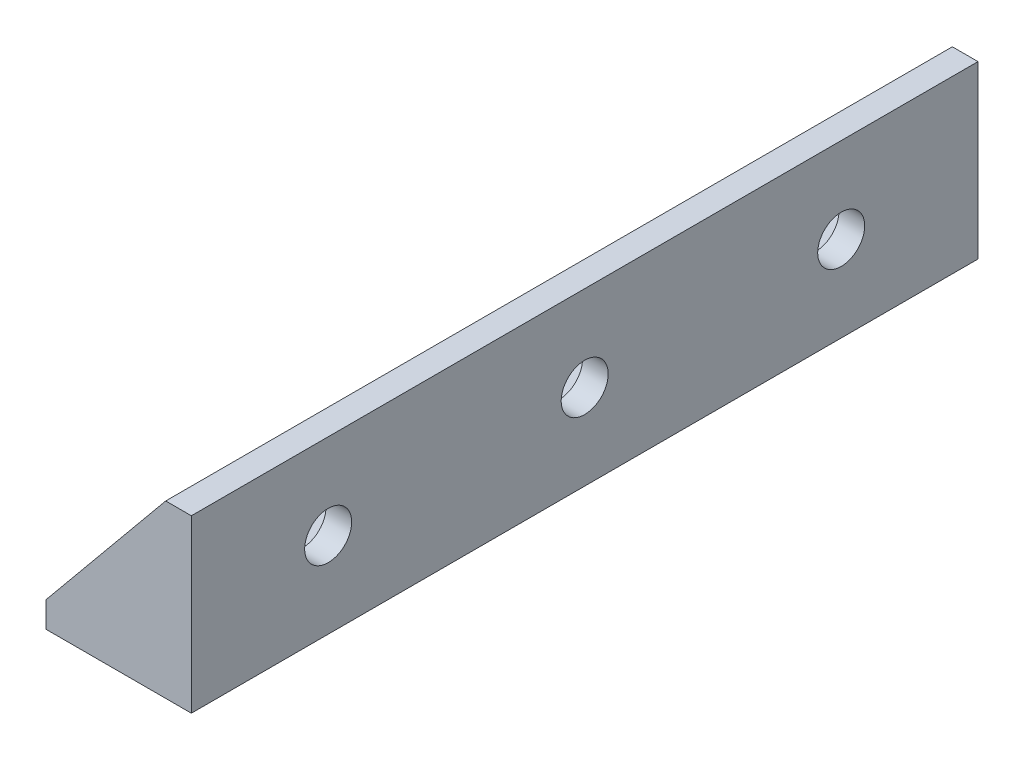
ISO-10303-21;
HEADER;
FILE_DESCRIPTION(('STEP AP214'),'2;1');
FILE_NAME('part.step','',(''),(''),'','','');
FILE_SCHEMA(('AUTOMOTIVE_DESIGN { 1 0 10303 214 1 1 1 1 }'));
ENDSEC;
DATA;
#1=APPLICATION_CONTEXT('core data for automotive mechanical design processes');
#2=APPLICATION_PROTOCOL_DEFINITION('international standard','automotive_design',2000,#1);
#3=PRODUCT_CONTEXT('',#1,'mechanical');
#4=PRODUCT('Part','Part','',(#3));
#5=PRODUCT_RELATED_PRODUCT_CATEGORY('part','',(#4));
#6=PRODUCT_DEFINITION_FORMATION('','',#4);
#7=PRODUCT_DEFINITION_CONTEXT('part definition',#1,'design');
#8=PRODUCT_DEFINITION('design','',#6,#7);
#9=PRODUCT_DEFINITION_SHAPE('','',#8);
#10=(LENGTH_UNIT() NAMED_UNIT(*) SI_UNIT(.MILLI.,.METRE.));
#11=(NAMED_UNIT(*) PLANE_ANGLE_UNIT() SI_UNIT($,.RADIAN.));
#12=(NAMED_UNIT(*) SI_UNIT($,.STERADIAN.) SOLID_ANGLE_UNIT());
#13=UNCERTAINTY_MEASURE_WITH_UNIT(LENGTH_MEASURE(1.E-05),#10,'distance_accuracy_value','');
#14=(GEOMETRIC_REPRESENTATION_CONTEXT(3) GLOBAL_UNCERTAINTY_ASSIGNED_CONTEXT((#13)) GLOBAL_UNIT_ASSIGNED_CONTEXT((#10,
#11,#12)) REPRESENTATION_CONTEXT('',''));
#15=CARTESIAN_POINT('',(0.,0.,0.));
#16=DIRECTION('',(0.,0.,1.));
#17=DIRECTION('',(1.,0.,0.));
#18=AXIS2_PLACEMENT_3D('',#15,#16,#17);
#19=CARTESIAN_POINT('',(0.,3.,0.));
#20=DIRECTION('',(0.,1.,0.));
#21=DIRECTION('',(0.,0.,1.));
#22=AXIS2_PLACEMENT_3D('',#19,#20,#21);
#23=PLANE('',#22);
#24=CARTESIAN_POINT('',(0.,3.,30.));
#25=DIRECTION('',(0.,1.,0.));
#26=DIRECTION('',(0.,0.,1.));
#27=AXIS2_PLACEMENT_3D('',#24,#25,#26);
#28=CIRCLE('',#27,2.5);
#29=CARTESIAN_POINT('',(0.,3.,32.5));
#30=VERTEX_POINT('',#29);
#31=EDGE_CURVE('E186',#30,#30,#28,.T.);
#32=ORIENTED_EDGE('',*,*,#31,.F.);
#33=EDGE_LOOP('',(#32));
#34=FACE_BOUND('',#33,.T.);
#35=DIRECTION('',(0.,0.,-1.));
#36=VECTOR('',#35,1.);
#37=CARTESIAN_POINT('',(6.99999999999999,3.,0.));
#38=LINE('',#37,#36);
#39=CARTESIAN_POINT('',(7.,3.,40.));
#40=VERTEX_POINT('',#39);
#41=CARTESIAN_POINT('',(7.,3.,19.));
#42=VERTEX_POINT('',#41);
#43=EDGE_CURVE('E64',#40,#42,#38,.T.);
#44=ORIENTED_EDGE('',*,*,#43,.T.);
#45=DIRECTION('',(-1.,0.,0.));
#46=VECTOR('',#45,1.);
#47=CARTESIAN_POINT('',(0.,3.,19.));
#48=LINE('',#47,#46);
#49=CARTESIAN_POINT('',(-7.,3.,19.));
#50=VERTEX_POINT('',#49);
#51=EDGE_CURVE('E212',#42,#50,#48,.T.);
#52=ORIENTED_EDGE('',*,*,#51,.T.);
#53=DIRECTION('',(0.,0.,1.));
#54=VECTOR('',#53,1.);
#55=CARTESIAN_POINT('',(-7.00000000000003,3.,0.));
#56=LINE('',#55,#54);
#57=CARTESIAN_POINT('',(-7.,3.,40.));
#58=VERTEX_POINT('',#57);
#59=EDGE_CURVE('E191',#50,#58,#56,.T.);
#60=ORIENTED_EDGE('',*,*,#59,.T.);
#61=DIRECTION('',(-1.,0.,0.));
#62=VECTOR('',#61,1.);
#63=CARTESIAN_POINT('',(0.,3.,40.));
#64=LINE('',#63,#62);
#65=EDGE_CURVE('E232',#40,#58,#64,.T.);
#66=ORIENTED_EDGE('',*,*,#65,.F.);
#67=EDGE_LOOP('',(#44,#52,#60,#66));
#68=FACE_BOUND('',#67,.T.);
#69=ADVANCED_FACE('F40',(#34,#68),#23,.T.);
#70=CARTESIAN_POINT('',(0.,3.,-30.));
#71=DIRECTION('',(0.,1.,0.));
#72=DIRECTION('',(0.,0.,1.));
#73=AXIS2_PLACEMENT_3D('',#70,#71,#72);
#74=CIRCLE('',#73,2.5);
#75=CARTESIAN_POINT('',(0.,3.,-27.5));
#76=VERTEX_POINT('',#75);
#77=EDGE_CURVE('E216',#76,#76,#74,.T.);
#78=ORIENTED_EDGE('',*,*,#77,.F.);
#79=EDGE_LOOP('',(#78));
#80=FACE_BOUND('',#79,.T.);
#81=DIRECTION('',(0.,0.,-1.));
#82=VECTOR('',#81,1.);
#83=CARTESIAN_POINT('',(6.99999999999998,3.,0.));
#84=LINE('',#83,#82);
#85=CARTESIAN_POINT('',(6.99999999999999,3.,-19.));
#86=VERTEX_POINT('',#85);
#87=CARTESIAN_POINT('',(7.,3.,-40.));
#88=VERTEX_POINT('',#87);
#89=EDGE_CURVE('E240',#86,#88,#84,.T.);
#90=ORIENTED_EDGE('',*,*,#89,.T.);
#91=DIRECTION('',(-1.,0.,0.));
#92=VECTOR('',#91,1.);
#93=CARTESIAN_POINT('',(0.,3.,-40.));
#94=LINE('',#93,#92);
#95=CARTESIAN_POINT('',(-7.,3.,-40.));
#96=VERTEX_POINT('',#95);
#97=EDGE_CURVE('E236',#88,#96,#94,.T.);
#98=ORIENTED_EDGE('',*,*,#97,.T.);
#99=CARTESIAN_POINT('',(-7.,3.,-19.));
#100=VERTEX_POINT('',#99);
#101=EDGE_CURVE('E165',#96,#100,#56,.T.);
#102=ORIENTED_EDGE('',*,*,#101,.T.);
#103=DIRECTION('',(-1.,0.,0.));
#104=VECTOR('',#103,1.);
#105=CARTESIAN_POINT('',(0.,3.,-19.));
#106=LINE('',#105,#104);
#107=EDGE_CURVE('E243',#86,#100,#106,.T.);
#108=ORIENTED_EDGE('',*,*,#107,.F.);
#109=EDGE_LOOP('',(#90,#98,#102,#108));
#110=FACE_BOUND('',#109,.T.);
#111=ADVANCED_FACE('F374',(#80,#110),#23,.T.);
#112=CARTESIAN_POINT('',(0.,3.,0.));
#113=DIRECTION('',(0.,1.,0.));
#114=DIRECTION('',(0.,0.,1.));
#115=AXIS2_PLACEMENT_3D('',#112,#113,#114);
#116=CIRCLE('',#115,2.5);
#117=CARTESIAN_POINT('',(0.,3.,2.5));
#118=VERTEX_POINT('',#117);
#119=EDGE_CURVE('E220',#118,#118,#116,.T.);
#120=ORIENTED_EDGE('',*,*,#119,.F.);
#121=EDGE_LOOP('',(#120));
#122=FACE_BOUND('',#121,.T.);
#123=DIRECTION('',(0.,0.,-1.));
#124=VECTOR('',#123,1.);
#125=CARTESIAN_POINT('',(7.,3.,0.));
#126=LINE('',#125,#124);
#127=CARTESIAN_POINT('',(7.,3.,11.));
#128=VERTEX_POINT('',#127);
#129=CARTESIAN_POINT('',(6.99999999999999,3.,-11.));
#130=VERTEX_POINT('',#129);
#131=EDGE_CURVE('E251',#128,#130,#126,.T.);
#132=ORIENTED_EDGE('',*,*,#131,.T.);
#133=DIRECTION('',(-1.,0.,0.));
#134=VECTOR('',#133,1.);
#135=CARTESIAN_POINT('',(0.,3.,-11.));
#136=LINE('',#135,#134);
#137=CARTESIAN_POINT('',(-7.,3.,-11.));
#138=VERTEX_POINT('',#137);
#139=EDGE_CURVE('E247',#130,#138,#136,.T.);
#140=ORIENTED_EDGE('',*,*,#139,.T.);
#141=CARTESIAN_POINT('',(-7.,3.,11.));
#142=VERTEX_POINT('',#141);
#143=EDGE_CURVE('E227',#138,#142,#56,.T.);
#144=ORIENTED_EDGE('',*,*,#143,.T.);
#145=DIRECTION('',(-1.,0.,0.));
#146=VECTOR('',#145,1.);
#147=CARTESIAN_POINT('',(0.,3.,11.));
#148=LINE('',#147,#146);
#149=EDGE_CURVE('E254',#128,#142,#148,.T.);
#150=ORIENTED_EDGE('',*,*,#149,.F.);
#151=EDGE_LOOP('',(#132,#140,#144,#150));
#152=FACE_BOUND('',#151,.T.);
#153=ADVANCED_FACE('F380',(#122,#152),#23,.T.);
#154=CARTESIAN_POINT('',(0.,3.,-46.));
#155=DIRECTION('',(0.,0.,-1.));
#156=DIRECTION('',(-1.,0.,0.));
#157=AXIS2_PLACEMENT_3D('',#154,#155,#156);
#158=PLANE('',#157);
#159=DIRECTION('',(0.6357072528611,0.77193023561705,0.));
#160=VECTOR('',#159,1.);
#161=CARTESIAN_POINT('',(-5.64329896907217,4.64742268041237,-46.));
#162=LINE('',#161,#160);
#163=CARTESIAN_POINT('',(-7.,3.,-46.));
#164=VERTEX_POINT('',#163);
#165=CARTESIAN_POINT('',(7.,20.,-46.));
#166=VERTEX_POINT('',#165);
#167=EDGE_CURVE('E142',#164,#166,#162,.T.);
#168=ORIENTED_EDGE('',*,*,#167,.T.);
#169=DIRECTION('',(1.,0.,0.));
#170=VECTOR('',#169,1.);
#171=CARTESIAN_POINT('',(0.,20.,-46.));
#172=LINE('',#171,#170);
#173=CARTESIAN_POINT('',(10.,20.,-46.));
#174=VERTEX_POINT('',#173);
#175=EDGE_CURVE('E290',#166,#174,#172,.T.);
#176=ORIENTED_EDGE('',*,*,#175,.T.);
#177=DIRECTION('',(0.,-1.,0.));
#178=VECTOR('',#177,1.);
#179=CARTESIAN_POINT('',(10.,3.,-46.));
#180=LINE('',#179,#178);
#181=CARTESIAN_POINT('',(10.,0.,-46.));
#182=VERTEX_POINT('',#181);
#183=EDGE_CURVE('E183',#174,#182,#180,.T.);
#184=ORIENTED_EDGE('',*,*,#183,.T.);
#185=DIRECTION('',(1.,0.,0.));
#186=VECTOR('',#185,1.);
#187=CARTESIAN_POINT('',(0.,0.,-46.));
#188=LINE('',#187,#186);
#189=CARTESIAN_POINT('',(-7.,0.,-46.));
#190=VERTEX_POINT('',#189);
#191=EDGE_CURVE('E171',#190,#182,#188,.T.);
#192=ORIENTED_EDGE('',*,*,#191,.F.);
#193=DIRECTION('',(0.,-1.,0.));
#194=VECTOR('',#193,1.);
#195=CARTESIAN_POINT('',(-7.,3.,-46.));
#196=LINE('',#195,#194);
#197=EDGE_CURVE('E161',#164,#190,#196,.T.);
#198=ORIENTED_EDGE('',*,*,#197,.F.);
#199=EDGE_LOOP('',(#168,#176,#184,#192,#198));
#200=FACE_BOUND('',#199,.T.);
#201=ADVANCED_FACE('F42',(#200),#158,.T.);
#202=CARTESIAN_POINT('',(-7.00000000000003,3.,0.));
#203=DIRECTION('',(1.,0.,0.));
#204=DIRECTION('',(0.,0.,-1.));
#205=AXIS2_PLACEMENT_3D('',#202,#203,#204);
#206=PLANE('',#205);
#207=DIRECTION('',(0.,-1.,0.));
#208=VECTOR('',#207,1.);
#209=CARTESIAN_POINT('',(-7.,3.,46.));
#210=LINE('',#209,#208);
#211=CARTESIAN_POINT('',(-7.,3.,46.));
#212=VERTEX_POINT('',#211);
#213=CARTESIAN_POINT('',(-7.,0.,46.));
#214=VERTEX_POINT('',#213);
#215=EDGE_CURVE('E173',#212,#214,#210,.T.);
#216=ORIENTED_EDGE('',*,*,#215,.F.);
#217=DIRECTION('',(0.,0.,1.));
#218=VECTOR('',#217,1.);
#219=CARTESIAN_POINT('',(-7.,3.,-46.));
#220=LINE('',#219,#218);
#221=EDGE_CURVE('E153',#58,#212,#220,.T.);
#222=ORIENTED_EDGE('',*,*,#221,.F.);
#223=ORIENTED_EDGE('',*,*,#59,.F.);
#224=EDGE_CURVE('E395',#142,#50,#220,.T.);
#225=ORIENTED_EDGE('',*,*,#224,.F.);
#226=ORIENTED_EDGE('',*,*,#143,.F.);
#227=EDGE_CURVE('E167',#100,#138,#220,.T.);
#228=ORIENTED_EDGE('',*,*,#227,.F.);
#229=ORIENTED_EDGE('',*,*,#101,.F.);
#230=EDGE_CURVE('E145',#164,#96,#220,.T.);
#231=ORIENTED_EDGE('',*,*,#230,.F.);
#232=ORIENTED_EDGE('',*,*,#197,.T.);
#233=DIRECTION('',(0.,0.,1.));
#234=VECTOR('',#233,1.);
#235=CARTESIAN_POINT('',(-7.00000000000003,0.,0.));
#236=LINE('',#235,#234);
#237=EDGE_CURVE('E207',#190,#214,#236,.T.);
#238=ORIENTED_EDGE('',*,*,#237,.T.);
#239=EDGE_LOOP('',(#216,#222,#223,#225,#226,#228,#229,#231,#232,#238));
#240=FACE_BOUND('',#239,.T.);
#241=ADVANCED_FACE('F159',(#240),#206,.F.);
#242=CARTESIAN_POINT('',(0.,3.,46.));
#243=DIRECTION('',(0.,0.,-1.));
#244=DIRECTION('',(-1.,0.,0.));
#245=AXIS2_PLACEMENT_3D('',#242,#243,#244);
#246=PLANE('',#245);
#247=DIRECTION('',(1.,0.,0.));
#248=VECTOR('',#247,1.);
#249=CARTESIAN_POINT('',(0.,20.,46.));
#250=LINE('',#249,#248);
#251=CARTESIAN_POINT('',(7.,20.,46.));
#252=VERTEX_POINT('',#251);
#253=CARTESIAN_POINT('',(10.,20.,46.));
#254=VERTEX_POINT('',#253);
#255=EDGE_CURVE('E297',#252,#254,#250,.T.);
#256=ORIENTED_EDGE('',*,*,#255,.F.);
#257=DIRECTION('',(-0.6357072528611,-0.77193023561705,0.));
#258=VECTOR('',#257,1.);
#259=CARTESIAN_POINT('',(-4.17113402061856,6.43505154639175,46.));
#260=LINE('',#259,#258);
#261=EDGE_CURVE('E56',#252,#212,#260,.T.);
#262=ORIENTED_EDGE('',*,*,#261,.T.);
#263=ORIENTED_EDGE('',*,*,#215,.T.);
#264=DIRECTION('',(1.,0.,0.));
#265=VECTOR('',#264,1.);
#266=CARTESIAN_POINT('',(0.,0.,46.));
#267=LINE('',#266,#265);
#268=CARTESIAN_POINT('',(10.,0.,46.));
#269=VERTEX_POINT('',#268);
#270=EDGE_CURVE('E204',#214,#269,#267,.T.);
#271=ORIENTED_EDGE('',*,*,#270,.T.);
#272=DIRECTION('',(0.,-1.,0.));
#273=VECTOR('',#272,1.);
#274=CARTESIAN_POINT('',(10.,3.,46.));
#275=LINE('',#274,#273);
#276=EDGE_CURVE('E178',#254,#269,#275,.T.);
#277=ORIENTED_EDGE('',*,*,#276,.F.);
#278=EDGE_LOOP('',(#256,#262,#263,#271,#277));
#279=FACE_BOUND('',#278,.T.);
#280=ADVANCED_FACE('F405',(#279),#246,.F.);
#281=CARTESIAN_POINT('',(0.,3.,-30.));
#282=DIRECTION('',(0.,-1.,0.));
#283=DIRECTION('',(0.,0.,-1.));
#284=AXIS2_PLACEMENT_3D('',#281,#282,#283);
#285=CYLINDRICAL_SURFACE('',#284,2.5);
#286=ORIENTED_EDGE('',*,*,#77,.T.);
#287=EDGE_LOOP('',(#286));
#288=FACE_BOUND('',#287,.T.);
#289=CARTESIAN_POINT('',(0.,0.,-30.));
#290=DIRECTION('',(0.,1.,0.));
#291=DIRECTION('',(0.,0.,1.));
#292=AXIS2_PLACEMENT_3D('',#289,#290,#291);
#293=CIRCLE('',#292,2.5);
#294=CARTESIAN_POINT('',(0.,0.,-27.5));
#295=VERTEX_POINT('',#294);
#296=EDGE_CURVE('E192',#295,#295,#293,.T.);
#297=ORIENTED_EDGE('',*,*,#296,.F.);
#298=EDGE_LOOP('',(#297));
#299=FACE_BOUND('',#298,.T.);
#300=ADVANCED_FACE('F457',(#288,#299),#285,.F.);
#301=CARTESIAN_POINT('',(0.,3.,0.));
#302=DIRECTION('',(0.,-1.,0.));
#303=DIRECTION('',(0.,0.,-1.));
#304=AXIS2_PLACEMENT_3D('',#301,#302,#303);
#305=CYLINDRICAL_SURFACE('',#304,2.5);
#306=ORIENTED_EDGE('',*,*,#119,.T.);
#307=EDGE_LOOP('',(#306));
#308=FACE_BOUND('',#307,.T.);
#309=CARTESIAN_POINT('',(0.,0.,0.));
#310=DIRECTION('',(0.,1.,0.));
#311=DIRECTION('',(0.,0.,1.));
#312=AXIS2_PLACEMENT_3D('',#309,#310,#311);
#313=CIRCLE('',#312,2.5);
#314=CARTESIAN_POINT('',(0.,0.,2.5));
#315=VERTEX_POINT('',#314);
#316=EDGE_CURVE('E196',#315,#315,#313,.T.);
#317=ORIENTED_EDGE('',*,*,#316,.F.);
#318=EDGE_LOOP('',(#317));
#319=FACE_BOUND('',#318,.T.);
#320=ADVANCED_FACE('F454',(#308,#319),#305,.F.);
#321=CARTESIAN_POINT('',(10.,3.,0.));
#322=DIRECTION('',(1.,0.,0.));
#323=DIRECTION('',(0.,0.,-1.));
#324=AXIS2_PLACEMENT_3D('',#321,#322,#323);
#325=PLANE('',#324);
#326=CARTESIAN_POINT('',(10.,10.,-30.));
#327=DIRECTION('',(1.,0.,0.));
#328=DIRECTION('',(0.,0.,-1.));
#329=AXIS2_PLACEMENT_3D('',#326,#327,#328);
#330=CIRCLE('',#329,2.75);
#331=CARTESIAN_POINT('',(10.,10.,-32.75));
#332=VERTEX_POINT('',#331);
#333=EDGE_CURVE('E331',#332,#332,#330,.T.);
#334=ORIENTED_EDGE('',*,*,#333,.F.);
#335=EDGE_LOOP('',(#334));
#336=FACE_BOUND('',#335,.T.);
#337=CARTESIAN_POINT('',(10.,10.,0.));
#338=DIRECTION('',(1.,0.,0.));
#339=DIRECTION('',(0.,0.,-1.));
#340=AXIS2_PLACEMENT_3D('',#337,#338,#339);
#341=CIRCLE('',#340,2.75);
#342=CARTESIAN_POINT('',(10.,10.,-2.75));
#343=VERTEX_POINT('',#342);
#344=EDGE_CURVE('E334',#343,#343,#341,.T.);
#345=ORIENTED_EDGE('',*,*,#344,.F.);
#346=EDGE_LOOP('',(#345));
#347=FACE_BOUND('',#346,.T.);
#348=CARTESIAN_POINT('',(10.,10.,30.));
#349=DIRECTION('',(1.,0.,0.));
#350=DIRECTION('',(0.,0.,-1.));
#351=AXIS2_PLACEMENT_3D('',#348,#349,#350);
#352=CIRCLE('',#351,2.75);
#353=CARTESIAN_POINT('',(10.,10.,27.25));
#354=VERTEX_POINT('',#353);
#355=EDGE_CURVE('E154',#354,#354,#352,.T.);
#356=ORIENTED_EDGE('',*,*,#355,.F.);
#357=EDGE_LOOP('',(#356));
#358=FACE_BOUND('',#357,.T.);
#359=DIRECTION('',(0.,0.,1.));
#360=VECTOR('',#359,1.);
#361=CARTESIAN_POINT('',(10.,0.,0.));
#362=LINE('',#361,#360);
#363=EDGE_CURVE('E200',#182,#269,#362,.T.);
#364=ORIENTED_EDGE('',*,*,#363,.F.);
#365=ORIENTED_EDGE('',*,*,#183,.F.);
#366=DIRECTION('',(0.,0.,1.));
#367=VECTOR('',#366,1.);
#368=CARTESIAN_POINT('',(10.,20.,0.));
#369=LINE('',#368,#367);
#370=EDGE_CURVE('E293',#174,#254,#369,.T.);
#371=ORIENTED_EDGE('',*,*,#370,.T.);
#372=ORIENTED_EDGE('',*,*,#276,.T.);
#373=EDGE_LOOP('',(#364,#365,#371,#372));
#374=FACE_BOUND('',#373,.T.);
#375=ADVANCED_FACE('F414',(#336,#347,#358,#374),#325,.T.);
#376=CARTESIAN_POINT('',(0.,3.,30.));
#377=DIRECTION('',(0.,-1.,0.));
#378=DIRECTION('',(0.,0.,-1.));
#379=AXIS2_PLACEMENT_3D('',#376,#377,#378);
#380=CYLINDRICAL_SURFACE('',#379,2.5);
#381=ORIENTED_EDGE('',*,*,#31,.T.);
#382=EDGE_LOOP('',(#381));
#383=FACE_BOUND('',#382,.T.);
#384=CARTESIAN_POINT('',(0.,0.,30.));
#385=DIRECTION('',(0.,1.,0.));
#386=DIRECTION('',(0.,0.,1.));
#387=AXIS2_PLACEMENT_3D('',#384,#385,#386);
#388=CIRCLE('',#387,2.5);
#389=CARTESIAN_POINT('',(0.,0.,32.5));
#390=VERTEX_POINT('',#389);
#391=EDGE_CURVE('E187',#390,#390,#388,.T.);
#392=ORIENTED_EDGE('',*,*,#391,.F.);
#393=EDGE_LOOP('',(#392));
#394=FACE_BOUND('',#393,.T.);
#395=ADVANCED_FACE('F462',(#383,#394),#380,.F.);
#396=CARTESIAN_POINT('',(0.,0.,0.));
#397=DIRECTION('',(0.,1.,0.));
#398=DIRECTION('',(0.,0.,1.));
#399=AXIS2_PLACEMENT_3D('',#396,#397,#398);
#400=PLANE('',#399);
#401=ORIENTED_EDGE('',*,*,#270,.F.);
#402=ORIENTED_EDGE('',*,*,#237,.F.);
#403=ORIENTED_EDGE('',*,*,#191,.T.);
#404=ORIENTED_EDGE('',*,*,#363,.T.);
#405=EDGE_LOOP('',(#401,#402,#403,#404));
#406=FACE_BOUND('',#405,.T.);
#407=ORIENTED_EDGE('',*,*,#316,.T.);
#408=EDGE_LOOP('',(#407));
#409=FACE_BOUND('',#408,.T.);
#410=ORIENTED_EDGE('',*,*,#296,.T.);
#411=EDGE_LOOP('',(#410));
#412=FACE_BOUND('',#411,.T.);
#413=ORIENTED_EDGE('',*,*,#391,.T.);
#414=EDGE_LOOP('',(#413));
#415=FACE_BOUND('',#414,.T.);
#416=ADVANCED_FACE('F409',(#406,#409,#412,#415),#400,.F.);
#417=CARTESIAN_POINT('',(0.,20.,19.));
#418=DIRECTION('',(0.,0.,-1.));
#419=DIRECTION('',(-1.,0.,0.));
#420=AXIS2_PLACEMENT_3D('',#417,#418,#419);
#421=PLANE('',#420);
#422=DIRECTION('',(0.,-1.,0.));
#423=VECTOR('',#422,1.);
#424=CARTESIAN_POINT('',(7.,20.,19.));
#425=LINE('',#424,#423);
#426=CARTESIAN_POINT('',(7.,20.,19.));
#427=VERTEX_POINT('',#426);
#428=EDGE_CURVE('E258',#427,#42,#425,.T.);
#429=ORIENTED_EDGE('',*,*,#428,.F.);
#430=DIRECTION('',(-0.6357072528611,-0.77193023561705,0.));
#431=VECTOR('',#430,1.);
#432=CARTESIAN_POINT('',(4.17113402061856,16.5649484536082,19.));
#433=LINE('',#432,#431);
#434=EDGE_CURVE('E306',#427,#50,#433,.T.);
#435=ORIENTED_EDGE('',*,*,#434,.T.);
#436=ORIENTED_EDGE('',*,*,#51,.F.);
#437=EDGE_LOOP('',(#429,#435,#436));
#438=FACE_BOUND('',#437,.T.);
#439=ADVANCED_FACE('F424',(#438),#421,.F.);
#440=CARTESIAN_POINT('',(6.99999999999999,20.,0.));
#441=DIRECTION('',(1.,0.,0.));
#442=DIRECTION('',(0.,0.,-1.));
#443=AXIS2_PLACEMENT_3D('',#440,#441,#442);
#444=PLANE('',#443);
#445=CARTESIAN_POINT('',(6.99999999999998,10.,30.));
#446=DIRECTION('',(-1.,0.,0.));
#447=DIRECTION('',(0.,0.,1.));
#448=AXIS2_PLACEMENT_3D('',#445,#446,#447);
#449=CIRCLE('',#448,2.75);
#450=CARTESIAN_POINT('',(6.99999999999998,10.,32.75));
#451=VERTEX_POINT('',#450);
#452=EDGE_CURVE('E339',#451,#451,#449,.T.);
#453=ORIENTED_EDGE('',*,*,#452,.F.);
#454=EDGE_LOOP('',(#453));
#455=FACE_BOUND('',#454,.T.);
#456=ORIENTED_EDGE('',*,*,#43,.F.);
#457=DIRECTION('',(0.,-1.,0.));
#458=VECTOR('',#457,1.);
#459=CARTESIAN_POINT('',(7.,20.,40.));
#460=LINE('',#459,#458);
#461=CARTESIAN_POINT('',(7.,20.,40.));
#462=VERTEX_POINT('',#461);
#463=EDGE_CURVE('E262',#462,#40,#460,.T.);
#464=ORIENTED_EDGE('',*,*,#463,.F.);
#465=DIRECTION('',(0.,0.,1.));
#466=VECTOR('',#465,1.);
#467=CARTESIAN_POINT('',(6.99999999999999,20.,0.));
#468=LINE('',#467,#466);
#469=EDGE_CURVE('E300',#427,#462,#468,.T.);
#470=ORIENTED_EDGE('',*,*,#469,.F.);
#471=ORIENTED_EDGE('',*,*,#428,.T.);
#472=EDGE_LOOP('',(#456,#464,#470,#471));
#473=FACE_BOUND('',#472,.T.);
#474=ADVANCED_FACE('F421',(#455,#473),#444,.F.);
#475=CARTESIAN_POINT('',(0.,20.,40.));
#476=DIRECTION('',(0.,0.,-1.));
#477=DIRECTION('',(-1.,0.,0.));
#478=AXIS2_PLACEMENT_3D('',#475,#476,#477);
#479=PLANE('',#478);
#480=DIRECTION('',(-0.6357072528611,-0.77193023561705,0.));
#481=VECTOR('',#480,1.);
#482=CARTESIAN_POINT('',(4.17113402061856,16.5649484536082,40.));
#483=LINE('',#482,#481);
#484=EDGE_CURVE('E310',#462,#58,#483,.T.);
#485=ORIENTED_EDGE('',*,*,#484,.F.);
#486=ORIENTED_EDGE('',*,*,#463,.T.);
#487=ORIENTED_EDGE('',*,*,#65,.T.);
#488=EDGE_LOOP('',(#485,#486,#487));
#489=FACE_BOUND('',#488,.T.);
#490=ADVANCED_FACE('F419',(#489),#479,.T.);
#491=CARTESIAN_POINT('',(0.,20.,-40.));
#492=DIRECTION('',(0.,0.,-1.));
#493=DIRECTION('',(-1.,0.,0.));
#494=AXIS2_PLACEMENT_3D('',#491,#492,#493);
#495=PLANE('',#494);
#496=DIRECTION('',(0.,-1.,0.));
#497=VECTOR('',#496,1.);
#498=CARTESIAN_POINT('',(7.,20.,-40.));
#499=LINE('',#498,#497);
#500=CARTESIAN_POINT('',(7.,20.,-40.));
#501=VERTEX_POINT('',#500);
#502=EDGE_CURVE('E266',#501,#88,#499,.T.);
#503=ORIENTED_EDGE('',*,*,#502,.F.);
#504=DIRECTION('',(-0.6357072528611,-0.77193023561705,0.));
#505=VECTOR('',#504,1.);
#506=CARTESIAN_POINT('',(4.17113402061856,16.5649484536082,-40.));
#507=LINE('',#506,#505);
#508=EDGE_CURVE('E313',#501,#96,#507,.T.);
#509=ORIENTED_EDGE('',*,*,#508,.T.);
#510=ORIENTED_EDGE('',*,*,#97,.F.);
#511=EDGE_LOOP('',(#503,#509,#510));
#512=FACE_BOUND('',#511,.T.);
#513=ADVANCED_FACE('F357',(#512),#495,.F.);
#514=CARTESIAN_POINT('',(6.99999999999998,20.,0.));
#515=DIRECTION('',(1.,0.,0.));
#516=DIRECTION('',(0.,0.,-1.));
#517=AXIS2_PLACEMENT_3D('',#514,#515,#516);
#518=PLANE('',#517);
#519=CARTESIAN_POINT('',(6.99999999999998,10.,-30.));
#520=DIRECTION('',(-1.,0.,0.));
#521=DIRECTION('',(0.,0.,1.));
#522=AXIS2_PLACEMENT_3D('',#519,#520,#521);
#523=CIRCLE('',#522,2.75);
#524=CARTESIAN_POINT('',(6.99999999999998,10.,-27.25));
#525=VERTEX_POINT('',#524);
#526=EDGE_CURVE('E338',#525,#525,#523,.T.);
#527=ORIENTED_EDGE('',*,*,#526,.F.);
#528=EDGE_LOOP('',(#527));
#529=FACE_BOUND('',#528,.T.);
#530=ORIENTED_EDGE('',*,*,#89,.F.);
#531=DIRECTION('',(0.,-1.,0.));
#532=VECTOR('',#531,1.);
#533=CARTESIAN_POINT('',(6.99999999999999,20.,-19.));
#534=LINE('',#533,#532);
#535=CARTESIAN_POINT('',(7.,20.,-19.));
#536=VERTEX_POINT('',#535);
#537=EDGE_CURVE('E270',#536,#86,#534,.T.);
#538=ORIENTED_EDGE('',*,*,#537,.F.);
#539=DIRECTION('',(0.,0.,1.));
#540=VECTOR('',#539,1.);
#541=CARTESIAN_POINT('',(6.99999999999998,20.,0.));
#542=LINE('',#541,#540);
#543=EDGE_CURVE('E286',#501,#536,#542,.T.);
#544=ORIENTED_EDGE('',*,*,#543,.F.);
#545=ORIENTED_EDGE('',*,*,#502,.T.);
#546=EDGE_LOOP('',(#530,#538,#544,#545));
#547=FACE_BOUND('',#546,.T.);
#548=ADVANCED_FACE('F353',(#529,#547),#518,.F.);
#549=CARTESIAN_POINT('',(0.,20.,-19.));
#550=DIRECTION('',(0.,0.,-1.));
#551=DIRECTION('',(-1.,0.,0.));
#552=AXIS2_PLACEMENT_3D('',#549,#550,#551);
#553=PLANE('',#552);
#554=DIRECTION('',(-0.6357072528611,-0.77193023561705,0.));
#555=VECTOR('',#554,1.);
#556=CARTESIAN_POINT('',(4.17113402061856,16.5649484536082,-19.));
#557=LINE('',#556,#555);
#558=EDGE_CURVE('E316',#536,#100,#557,.T.);
#559=ORIENTED_EDGE('',*,*,#558,.F.);
#560=ORIENTED_EDGE('',*,*,#537,.T.);
#561=ORIENTED_EDGE('',*,*,#107,.T.);
#562=EDGE_LOOP('',(#559,#560,#561));
#563=FACE_BOUND('',#562,.T.);
#564=ADVANCED_FACE('F356',(#563),#553,.T.);
#565=CARTESIAN_POINT('',(0.,20.,-11.));
#566=DIRECTION('',(0.,0.,-1.));
#567=DIRECTION('',(-1.,0.,0.));
#568=AXIS2_PLACEMENT_3D('',#565,#566,#567);
#569=PLANE('',#568);
#570=DIRECTION('',(0.,-1.,0.));
#571=VECTOR('',#570,1.);
#572=CARTESIAN_POINT('',(6.99999999999999,20.,-11.));
#573=LINE('',#572,#571);
#574=CARTESIAN_POINT('',(6.99999999999999,20.,-11.));
#575=VERTEX_POINT('',#574);
#576=EDGE_CURVE('E274',#575,#130,#573,.T.);
#577=ORIENTED_EDGE('',*,*,#576,.F.);
#578=DIRECTION('',(-0.6357072528611,-0.77193023561705,0.));
#579=VECTOR('',#578,1.);
#580=CARTESIAN_POINT('',(4.17113402061856,16.5649484536082,-11.));
#581=LINE('',#580,#579);
#582=EDGE_CURVE('E319',#575,#138,#581,.T.);
#583=ORIENTED_EDGE('',*,*,#582,.T.);
#584=ORIENTED_EDGE('',*,*,#139,.F.);
#585=EDGE_LOOP('',(#577,#583,#584));
#586=FACE_BOUND('',#585,.T.);
#587=ADVANCED_FACE('F392',(#586),#569,.F.);
#588=CARTESIAN_POINT('',(7.,20.,0.));
#589=DIRECTION('',(1.,0.,0.));
#590=DIRECTION('',(0.,0.,-1.));
#591=AXIS2_PLACEMENT_3D('',#588,#589,#590);
#592=PLANE('',#591);
#593=CARTESIAN_POINT('',(6.99999999999998,10.,0.));
#594=DIRECTION('',(-1.,0.,0.));
#595=DIRECTION('',(0.,0.,1.));
#596=AXIS2_PLACEMENT_3D('',#593,#594,#595);
#597=CIRCLE('',#596,2.75);
#598=CARTESIAN_POINT('',(6.99999999999998,10.,2.75));
#599=VERTEX_POINT('',#598);
#600=EDGE_CURVE('E343',#599,#599,#597,.T.);
#601=ORIENTED_EDGE('',*,*,#600,.F.);
#602=EDGE_LOOP('',(#601));
#603=FACE_BOUND('',#602,.T.);
#604=ORIENTED_EDGE('',*,*,#131,.F.);
#605=DIRECTION('',(0.,-1.,0.));
#606=VECTOR('',#605,1.);
#607=CARTESIAN_POINT('',(7.,20.,11.));
#608=LINE('',#607,#606);
#609=CARTESIAN_POINT('',(7.,20.,11.));
#610=VERTEX_POINT('',#609);
#611=EDGE_CURVE('E278',#610,#128,#608,.T.);
#612=ORIENTED_EDGE('',*,*,#611,.F.);
#613=DIRECTION('',(0.,0.,1.));
#614=VECTOR('',#613,1.);
#615=CARTESIAN_POINT('',(7.,20.,0.));
#616=LINE('',#615,#614);
#617=EDGE_CURVE('E282',#575,#610,#616,.T.);
#618=ORIENTED_EDGE('',*,*,#617,.F.);
#619=ORIENTED_EDGE('',*,*,#576,.T.);
#620=EDGE_LOOP('',(#604,#612,#618,#619));
#621=FACE_BOUND('',#620,.T.);
#622=ADVANCED_FACE('F390',(#603,#621),#592,.F.);
#623=CARTESIAN_POINT('',(0.,20.,11.));
#624=DIRECTION('',(0.,0.,-1.));
#625=DIRECTION('',(-1.,0.,0.));
#626=AXIS2_PLACEMENT_3D('',#623,#624,#625);
#627=PLANE('',#626);
#628=DIRECTION('',(-0.6357072528611,-0.77193023561705,0.));
#629=VECTOR('',#628,1.);
#630=CARTESIAN_POINT('',(4.17113402061856,16.5649484536082,11.));
#631=LINE('',#630,#629);
#632=EDGE_CURVE('E323',#610,#142,#631,.T.);
#633=ORIENTED_EDGE('',*,*,#632,.F.);
#634=ORIENTED_EDGE('',*,*,#611,.T.);
#635=ORIENTED_EDGE('',*,*,#149,.T.);
#636=EDGE_LOOP('',(#633,#634,#635));
#637=FACE_BOUND('',#636,.T.);
#638=ADVANCED_FACE('F386',(#637),#627,.T.);
#639=CARTESIAN_POINT('',(0.,20.,0.));
#640=DIRECTION('',(0.,1.,0.));
#641=DIRECTION('',(0.,0.,1.));
#642=AXIS2_PLACEMENT_3D('',#639,#640,#641);
#643=PLANE('',#642);
#644=DIRECTION('',(0.,0.,-1.));
#645=VECTOR('',#644,1.);
#646=CARTESIAN_POINT('',(7.,20.,0.));
#647=LINE('',#646,#645);
#648=EDGE_CURVE('E11',#252,#462,#647,.T.);
#649=ORIENTED_EDGE('',*,*,#648,.F.);
#650=ORIENTED_EDGE('',*,*,#255,.T.);
#651=ORIENTED_EDGE('',*,*,#370,.F.);
#652=ORIENTED_EDGE('',*,*,#175,.F.);
#653=DIRECTION('',(0.,0.,1.));
#654=VECTOR('',#653,1.);
#655=CARTESIAN_POINT('',(7.,20.,-46.));
#656=LINE('',#655,#654);
#657=EDGE_CURVE('E148',#166,#501,#656,.T.);
#658=ORIENTED_EDGE('',*,*,#657,.T.);
#659=ORIENTED_EDGE('',*,*,#543,.T.);
#660=EDGE_CURVE('E50',#575,#536,#647,.T.);
#661=ORIENTED_EDGE('',*,*,#660,.F.);
#662=ORIENTED_EDGE('',*,*,#617,.T.);
#663=EDGE_CURVE('E49',#427,#610,#647,.T.);
#664=ORIENTED_EDGE('',*,*,#663,.F.);
#665=ORIENTED_EDGE('',*,*,#469,.T.);
#666=EDGE_LOOP('',(#649,#650,#651,#652,#658,#659,#661,#662,#664,#665));
#667=FACE_BOUND('',#666,.T.);
#668=ADVANCED_FACE('F370',(#667),#643,.T.);
#669=CARTESIAN_POINT('',(-5.64329896907217,4.64742268041237,-46.));
#670=DIRECTION('',(0.77193023561705,-0.6357072528611,0.));
#671=DIRECTION('',(0.6357072528611,0.77193023561705,0.));
#672=AXIS2_PLACEMENT_3D('',#669,#670,#671);
#673=PLANE('',#672);
#674=ORIENTED_EDGE('',*,*,#657,.F.);
#675=ORIENTED_EDGE('',*,*,#167,.F.);
#676=ORIENTED_EDGE('',*,*,#230,.T.);
#677=ORIENTED_EDGE('',*,*,#508,.F.);
#678=EDGE_LOOP('',(#674,#675,#676,#677));
#679=FACE_BOUND('',#678,.T.);
#680=ADVANCED_FACE('F144',(#679),#673,.F.);
#681=ORIENTED_EDGE('',*,*,#558,.T.);
#682=ORIENTED_EDGE('',*,*,#227,.T.);
#683=ORIENTED_EDGE('',*,*,#582,.F.);
#684=ORIENTED_EDGE('',*,*,#660,.T.);
#685=EDGE_LOOP('',(#681,#682,#683,#684));
#686=FACE_BOUND('',#685,.T.);
#687=ADVANCED_FACE('F393',(#686),#673,.F.);
#688=ORIENTED_EDGE('',*,*,#663,.T.);
#689=ORIENTED_EDGE('',*,*,#632,.T.);
#690=ORIENTED_EDGE('',*,*,#224,.T.);
#691=ORIENTED_EDGE('',*,*,#434,.F.);
#692=EDGE_LOOP('',(#688,#689,#690,#691));
#693=FACE_BOUND('',#692,.T.);
#694=ADVANCED_FACE('F425',(#693),#673,.F.);
#695=ORIENTED_EDGE('',*,*,#648,.T.);
#696=ORIENTED_EDGE('',*,*,#484,.T.);
#697=ORIENTED_EDGE('',*,*,#221,.T.);
#698=ORIENTED_EDGE('',*,*,#261,.F.);
#699=EDGE_LOOP('',(#695,#696,#697,#698));
#700=FACE_BOUND('',#699,.T.);
#701=ADVANCED_FACE('F400',(#700),#673,.F.);
#702=CARTESIAN_POINT('',(12.,10.,0.));
#703=DIRECTION('',(-1.,0.,0.));
#704=DIRECTION('',(0.,0.,1.));
#705=AXIS2_PLACEMENT_3D('',#702,#703,#704);
#706=CYLINDRICAL_SURFACE('',#705,2.75);
#707=ORIENTED_EDGE('',*,*,#344,.T.);
#708=EDGE_LOOP('',(#707));
#709=FACE_BOUND('',#708,.T.);
#710=ORIENTED_EDGE('',*,*,#600,.T.);
#711=EDGE_LOOP('',(#710));
#712=FACE_BOUND('',#711,.T.);
#713=ADVANCED_FACE('F433',(#709,#712),#706,.F.);
#714=CARTESIAN_POINT('',(12.,10.,-30.));
#715=DIRECTION('',(-1.,0.,0.));
#716=DIRECTION('',(0.,0.,1.));
#717=AXIS2_PLACEMENT_3D('',#714,#715,#716);
#718=CYLINDRICAL_SURFACE('',#717,2.75);
#719=ORIENTED_EDGE('',*,*,#333,.T.);
#720=EDGE_LOOP('',(#719));
#721=FACE_BOUND('',#720,.T.);
#722=ORIENTED_EDGE('',*,*,#526,.T.);
#723=EDGE_LOOP('',(#722));
#724=FACE_BOUND('',#723,.T.);
#725=ADVANCED_FACE('F351',(#721,#724),#718,.F.);
#726=CARTESIAN_POINT('',(12.,10.,30.));
#727=DIRECTION('',(-1.,0.,0.));
#728=DIRECTION('',(0.,0.,1.));
#729=AXIS2_PLACEMENT_3D('',#726,#727,#728);
#730=CYLINDRICAL_SURFACE('',#729,2.75);
#731=ORIENTED_EDGE('',*,*,#355,.T.);
#732=EDGE_LOOP('',(#731));
#733=FACE_BOUND('',#732,.T.);
#734=ORIENTED_EDGE('',*,*,#452,.T.);
#735=EDGE_LOOP('',(#734));
#736=FACE_BOUND('',#735,.T.);
#737=ADVANCED_FACE('F607',(#733,#736),#730,.F.);
#738=CLOSED_SHELL('',(#69,#111,#153,#201,#241,#280,#300,#320,#375,#395,#416,#439,#474,#490,#513,
#548,#564,#587,#622,#638,#668,#680,#687,#694,#701,#713,#725,#737));
#739=MANIFOLD_SOLID_BREP('B2',#738);
#740=ADVANCED_BREP_SHAPE_REPRESENTATION('',(#18,#739),#14);
#741=SHAPE_DEFINITION_REPRESENTATION(#9,#740);
ENDSEC;
END-ISO-10303-21;
